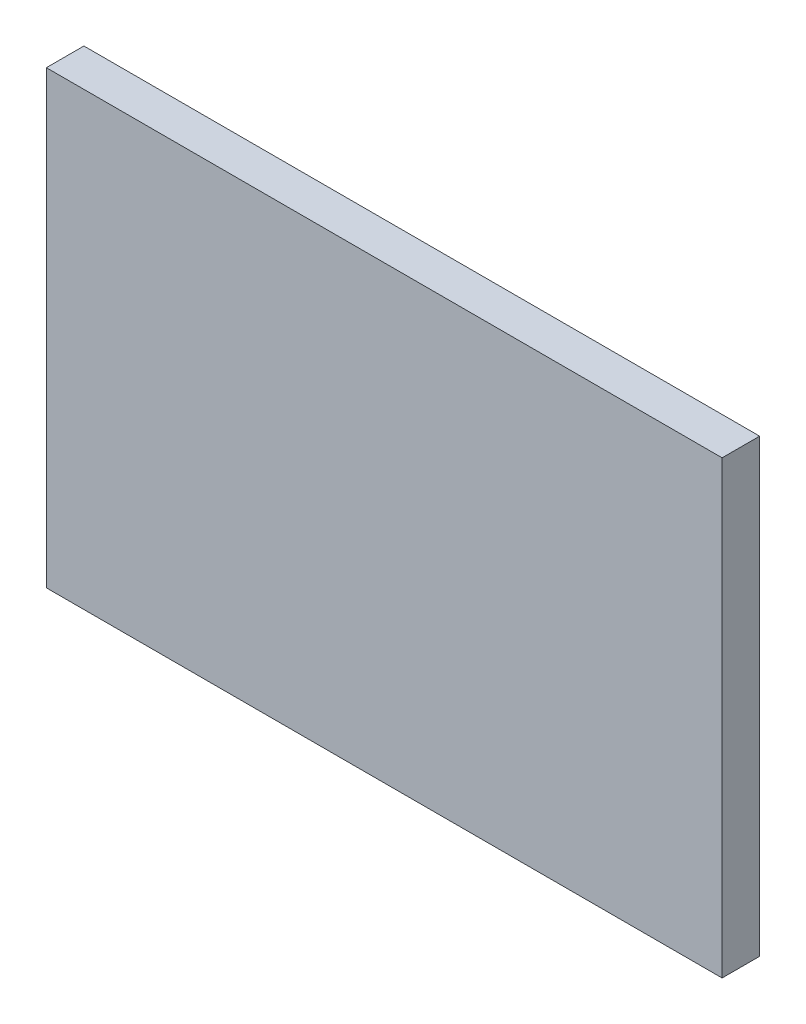
ISO-10303-21;
HEADER;
FILE_DESCRIPTION(('STEP AP214'),'2;1');
FILE_NAME('part.step','',(''),(''),'','','');
FILE_SCHEMA(('AUTOMOTIVE_DESIGN { 1 0 10303 214 1 1 1 1 }'));
ENDSEC;
DATA;
#1=APPLICATION_CONTEXT('core data for automotive mechanical design processes');
#2=APPLICATION_PROTOCOL_DEFINITION('international standard','automotive_design',2000,#1);
#3=PRODUCT_CONTEXT('',#1,'mechanical');
#4=PRODUCT('Part','Part','',(#3));
#5=PRODUCT_RELATED_PRODUCT_CATEGORY('part','',(#4));
#6=PRODUCT_DEFINITION_FORMATION('','',#4);
#7=PRODUCT_DEFINITION_CONTEXT('part definition',#1,'design');
#8=PRODUCT_DEFINITION('design','',#6,#7);
#9=PRODUCT_DEFINITION_SHAPE('','',#8);
#10=(LENGTH_UNIT() NAMED_UNIT(*) SI_UNIT(.MILLI.,.METRE.));
#11=(NAMED_UNIT(*) PLANE_ANGLE_UNIT() SI_UNIT($,.RADIAN.));
#12=(NAMED_UNIT(*) SI_UNIT($,.STERADIAN.) SOLID_ANGLE_UNIT());
#13=UNCERTAINTY_MEASURE_WITH_UNIT(LENGTH_MEASURE(1.E-05),#10,'distance_accuracy_value','');
#14=(GEOMETRIC_REPRESENTATION_CONTEXT(3) GLOBAL_UNCERTAINTY_ASSIGNED_CONTEXT((#13)) GLOBAL_UNIT_ASSIGNED_CONTEXT((#10,
#11,#12)) REPRESENTATION_CONTEXT('',''));
#15=CARTESIAN_POINT('',(0.,0.,0.));
#16=DIRECTION('',(0.,0.,1.));
#17=DIRECTION('',(1.,0.,0.));
#18=AXIS2_PLACEMENT_3D('',#15,#16,#17);
#19=CARTESIAN_POINT('',(-126.987951807229,48.433734939759,5.));
#20=DIRECTION('',(1.,0.,0.));
#21=DIRECTION('',(0.,0.,-1.));
#22=AXIS2_PLACEMENT_3D('',#19,#20,#21);
#23=PLANE('',#22);
#24=DIRECTION('',(0.,-1.,0.));
#25=VECTOR('',#24,1.);
#26=CARTESIAN_POINT('',(-126.987951807229,48.433734939759,0.));
#27=LINE('',#26,#25);
#28=CARTESIAN_POINT('',(-126.987951807229,48.433734939759,0.));
#29=VERTEX_POINT('',#28);
#30=CARTESIAN_POINT('',(-126.987951807229,-11.566265060241,0.));
#31=VERTEX_POINT('',#30);
#32=EDGE_CURVE('E98',#29,#31,#27,.T.);
#33=ORIENTED_EDGE('',*,*,#32,.T.);
#34=DIRECTION('',(0.,0.,-1.));
#35=VECTOR('',#34,1.);
#36=CARTESIAN_POINT('',(-126.987951807229,-11.566265060241,5.));
#37=LINE('',#36,#35);
#38=CARTESIAN_POINT('',(-126.987951807229,-11.566265060241,5.));
#39=VERTEX_POINT('',#38);
#40=EDGE_CURVE('E11',#39,#31,#37,.T.);
#41=ORIENTED_EDGE('',*,*,#40,.F.);
#42=DIRECTION('',(0.,-1.,0.));
#43=VECTOR('',#42,1.);
#44=CARTESIAN_POINT('',(-126.987951807229,48.433734939759,5.));
#45=LINE('',#44,#43);
#46=CARTESIAN_POINT('',(-126.987951807229,48.433734939759,5.));
#47=VERTEX_POINT('',#46);
#48=EDGE_CURVE('E86',#47,#39,#45,.T.);
#49=ORIENTED_EDGE('',*,*,#48,.F.);
#50=DIRECTION('',(0.,0.,-1.));
#51=VECTOR('',#50,1.);
#52=CARTESIAN_POINT('',(-126.987951807229,48.433734939759,5.));
#53=LINE('',#52,#51);
#54=EDGE_CURVE('E94',#47,#29,#53,.T.);
#55=ORIENTED_EDGE('',*,*,#54,.T.);
#56=EDGE_LOOP('',(#33,#41,#49,#55));
#57=FACE_BOUND('',#56,.T.);
#58=ADVANCED_FACE('F35',(#57),#23,.F.);
#59=CARTESIAN_POINT('',(-126.987951807229,-11.566265060241,5.));
#60=DIRECTION('',(0.,1.,0.));
#61=DIRECTION('',(0.,0.,1.));
#62=AXIS2_PLACEMENT_3D('',#59,#60,#61);
#63=PLANE('',#62);
#64=DIRECTION('',(1.,0.,0.));
#65=VECTOR('',#64,1.);
#66=CARTESIAN_POINT('',(-126.987951807229,-11.566265060241,0.));
#67=LINE('',#66,#65);
#68=CARTESIAN_POINT('',(-36.9879518072288,-11.566265060241,0.));
#69=VERTEX_POINT('',#68);
#70=EDGE_CURVE('E90',#31,#69,#67,.T.);
#71=ORIENTED_EDGE('',*,*,#70,.T.);
#72=DIRECTION('',(0.,0.,-1.));
#73=VECTOR('',#72,1.);
#74=CARTESIAN_POINT('',(-36.9879518072288,-11.566265060241,5.));
#75=LINE('',#74,#73);
#76=CARTESIAN_POINT('',(-36.9879518072288,-11.566265060241,5.));
#77=VERTEX_POINT('',#76);
#78=EDGE_CURVE('E43',#77,#69,#75,.T.);
#79=ORIENTED_EDGE('',*,*,#78,.F.);
#80=DIRECTION('',(1.,0.,0.));
#81=VECTOR('',#80,1.);
#82=CARTESIAN_POINT('',(-126.987951807229,-11.566265060241,5.));
#83=LINE('',#82,#81);
#84=EDGE_CURVE('E81',#39,#77,#83,.T.);
#85=ORIENTED_EDGE('',*,*,#84,.F.);
#86=ORIENTED_EDGE('',*,*,#40,.T.);
#87=EDGE_LOOP('',(#71,#79,#85,#86));
#88=FACE_BOUND('',#87,.T.);
#89=ADVANCED_FACE('F89',(#88),#63,.F.);
#90=CARTESIAN_POINT('',(-36.9879518072289,48.433734939759,5.));
#91=DIRECTION('',(-1.,0.,0.));
#92=DIRECTION('',(0.,-1.,0.));
#93=AXIS2_PLACEMENT_3D('',#90,#91,#92);
#94=PLANE('',#93);
#95=DIRECTION('',(0.,1.,0.));
#96=VECTOR('',#95,1.);
#97=CARTESIAN_POINT('',(-36.9879518072289,48.433734939759,0.));
#98=LINE('',#97,#96);
#99=CARTESIAN_POINT('',(-36.9879518072289,48.433734939759,0.));
#100=VERTEX_POINT('',#99);
#101=EDGE_CURVE('E68',#69,#100,#98,.T.);
#102=ORIENTED_EDGE('',*,*,#101,.T.);
#103=DIRECTION('',(0.,0.,-1.));
#104=VECTOR('',#103,1.);
#105=CARTESIAN_POINT('',(-36.9879518072289,48.433734939759,5.));
#106=LINE('',#105,#104);
#107=CARTESIAN_POINT('',(-36.9879518072289,48.433734939759,5.));
#108=VERTEX_POINT('',#107);
#109=EDGE_CURVE('E91',#108,#100,#106,.T.);
#110=ORIENTED_EDGE('',*,*,#109,.F.);
#111=DIRECTION('',(0.,1.,0.));
#112=VECTOR('',#111,1.);
#113=CARTESIAN_POINT('',(-36.9879518072289,48.433734939759,5.));
#114=LINE('',#113,#112);
#115=EDGE_CURVE('E84',#77,#108,#114,.T.);
#116=ORIENTED_EDGE('',*,*,#115,.F.);
#117=ORIENTED_EDGE('',*,*,#78,.T.);
#118=EDGE_LOOP('',(#102,#110,#116,#117));
#119=FACE_BOUND('',#118,.T.);
#120=ADVANCED_FACE('F92',(#119),#94,.F.);
#121=CARTESIAN_POINT('',(-126.987951807229,48.433734939759,5.));
#122=DIRECTION('',(0.,-1.,0.));
#123=DIRECTION('',(0.,0.,-1.));
#124=AXIS2_PLACEMENT_3D('',#121,#122,#123);
#125=PLANE('',#124);
#126=DIRECTION('',(-1.,0.,0.));
#127=VECTOR('',#126,1.);
#128=CARTESIAN_POINT('',(-126.987951807229,48.433734939759,0.));
#129=LINE('',#128,#127);
#130=EDGE_CURVE('E74',#100,#29,#129,.T.);
#131=ORIENTED_EDGE('',*,*,#130,.T.);
#132=ORIENTED_EDGE('',*,*,#54,.F.);
#133=DIRECTION('',(-1.,0.,0.));
#134=VECTOR('',#133,1.);
#135=CARTESIAN_POINT('',(-126.987951807229,48.433734939759,5.));
#136=LINE('',#135,#134);
#137=EDGE_CURVE('E51',#108,#47,#136,.T.);
#138=ORIENTED_EDGE('',*,*,#137,.F.);
#139=ORIENTED_EDGE('',*,*,#109,.T.);
#140=EDGE_LOOP('',(#131,#132,#138,#139));
#141=FACE_BOUND('',#140,.T.);
#142=ADVANCED_FACE('F105',(#141),#125,.F.);
#143=CARTESIAN_POINT('',(0.,0.,5.));
#144=DIRECTION('',(0.,0.,1.));
#145=DIRECTION('',(1.,0.,0.));
#146=AXIS2_PLACEMENT_3D('',#143,#144,#145);
#147=PLANE('',#146);
#148=ORIENTED_EDGE('',*,*,#48,.T.);
#149=ORIENTED_EDGE('',*,*,#84,.T.);
#150=ORIENTED_EDGE('',*,*,#115,.T.);
#151=ORIENTED_EDGE('',*,*,#137,.T.);
#152=EDGE_LOOP('',(#148,#149,#150,#151));
#153=FACE_BOUND('',#152,.T.);
#154=ADVANCED_FACE('F82',(#153),#147,.T.);
#155=CARTESIAN_POINT('',(0.,0.,0.));
#156=DIRECTION('',(0.,0.,1.));
#157=DIRECTION('',(1.,0.,0.));
#158=AXIS2_PLACEMENT_3D('',#155,#156,#157);
#159=PLANE('',#158);
#160=ORIENTED_EDGE('',*,*,#32,.F.);
#161=ORIENTED_EDGE('',*,*,#130,.F.);
#162=ORIENTED_EDGE('',*,*,#101,.F.);
#163=ORIENTED_EDGE('',*,*,#70,.F.);
#164=EDGE_LOOP('',(#160,#161,#162,#163));
#165=FACE_BOUND('',#164,.T.);
#166=ADVANCED_FACE('F108',(#165),#159,.F.);
#167=CLOSED_SHELL('',(#58,#89,#120,#142,#154,#166));
#168=MANIFOLD_SOLID_BREP('B2',#167);
#169=ADVANCED_BREP_SHAPE_REPRESENTATION('',(#18,#168),#14);
#170=SHAPE_DEFINITION_REPRESENTATION(#9,#169);
ENDSEC;
END-ISO-10303-21;
